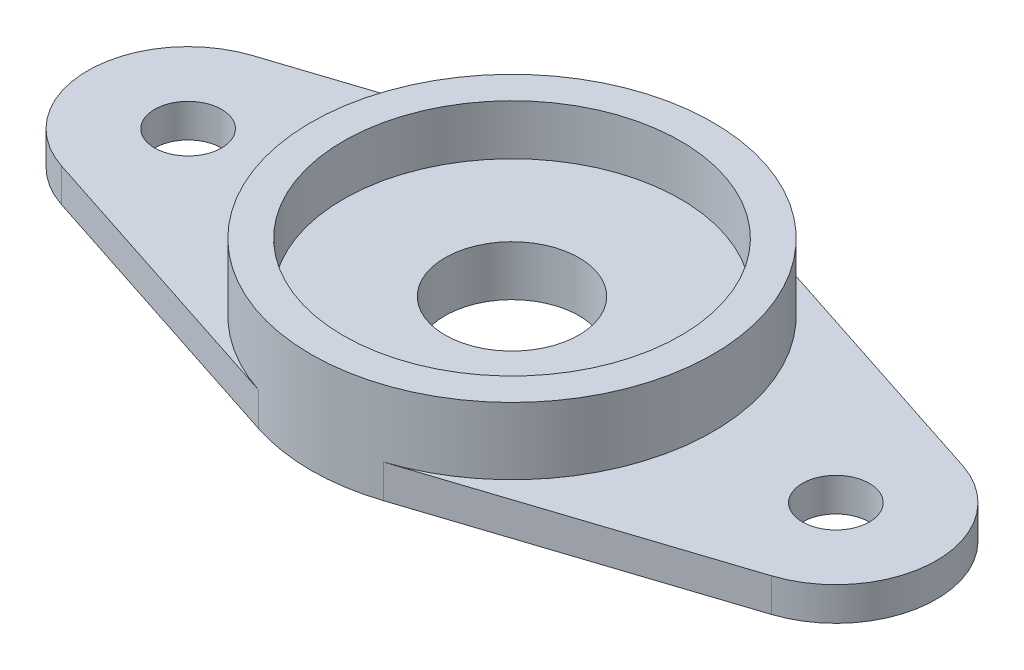
ISO-10303-21;
HEADER;
FILE_DESCRIPTION(('STEP AP214'),'2;1');
FILE_NAME('part.step','',(''),(''),'','','');
FILE_SCHEMA(('AUTOMOTIVE_DESIGN { 1 0 10303 214 1 1 1 1 }'));
ENDSEC;
DATA;
#1=APPLICATION_CONTEXT('core data for automotive mechanical design processes');
#2=APPLICATION_PROTOCOL_DEFINITION('international standard','automotive_design',2000,#1);
#3=PRODUCT_CONTEXT('',#1,'mechanical');
#4=PRODUCT('Part','Part','',(#3));
#5=PRODUCT_RELATED_PRODUCT_CATEGORY('part','',(#4));
#6=PRODUCT_DEFINITION_FORMATION('','',#4);
#7=PRODUCT_DEFINITION_CONTEXT('part definition',#1,'design');
#8=PRODUCT_DEFINITION('design','',#6,#7);
#9=PRODUCT_DEFINITION_SHAPE('','',#8);
#10=(LENGTH_UNIT() NAMED_UNIT(*) SI_UNIT(.MILLI.,.METRE.));
#11=(NAMED_UNIT(*) PLANE_ANGLE_UNIT() SI_UNIT($,.RADIAN.));
#12=(NAMED_UNIT(*) SI_UNIT($,.STERADIAN.) SOLID_ANGLE_UNIT());
#13=UNCERTAINTY_MEASURE_WITH_UNIT(LENGTH_MEASURE(1.E-05),#10,'distance_accuracy_value','');
#14=(GEOMETRIC_REPRESENTATION_CONTEXT(3) GLOBAL_UNCERTAINTY_ASSIGNED_CONTEXT((#13)) GLOBAL_UNIT_ASSIGNED_CONTEXT((#10,
#11,#12)) REPRESENTATION_CONTEXT('',''));
#15=CARTESIAN_POINT('',(0.,0.,0.));
#16=DIRECTION('',(0.,0.,1.));
#17=DIRECTION('',(1.,0.,0.));
#18=AXIS2_PLACEMENT_3D('',#15,#16,#17);
#19=CARTESIAN_POINT('',(-2.79214064115822,4.4972,-8.55593072903191));
#20=DIRECTION('',(-0.31023784901758,0.,-0.950658969892435));
#21=DIRECTION('',(-0.950658969892435,0.,0.31023784901758));
#22=AXIS2_PLACEMENT_3D('',#19,#20,#21);
#23=PLANE('',#22);
#24=DIRECTION('',(0.,-1.,0.));
#25=VECTOR('',#24,1.);
#26=CARTESIAN_POINT('',(-15.9010703205791,4.4972,-4.27796536451595));
#27=LINE('',#26,#25);
#28=CARTESIAN_POINT('',(-15.9010703205791,1.5,-4.27796536451595));
#29=VERTEX_POINT('',#28);
#30=CARTESIAN_POINT('',(-15.9010703205791,0.,-4.27796536451595));
#31=VERTEX_POINT('',#30);
#32=EDGE_CURVE('E12',#29,#31,#27,.T.);
#33=ORIENTED_EDGE('',*,*,#32,.F.);
#34=DIRECTION('',(-0.950658969892435,0.,0.31023784901758));
#35=VECTOR('',#34,1.);
#36=CARTESIAN_POINT('',(-2.79214064115822,1.5,-8.55593072903191));
#37=LINE('',#36,#35);
#38=CARTESIAN_POINT('',(-2.79214064115822,1.5,-8.55593072903191));
#39=VERTEX_POINT('',#38);
#40=EDGE_CURVE('E143',#39,#29,#37,.T.);
#41=ORIENTED_EDGE('',*,*,#40,.F.);
#42=DIRECTION('',(0.,-1.,0.));
#43=VECTOR('',#42,1.);
#44=CARTESIAN_POINT('',(-2.79214064115822,4.4972,-8.55593072903191));
#45=LINE('',#44,#43);
#46=CARTESIAN_POINT('',(-2.79214064115822,0.,-8.55593072903191));
#47=VERTEX_POINT('',#46);
#48=EDGE_CURVE('E87',#39,#47,#45,.T.);
#49=ORIENTED_EDGE('',*,*,#48,.T.);
#50=DIRECTION('',(0.950658969892435,0.,-0.31023784901758));
#51=VECTOR('',#50,1.);
#52=CARTESIAN_POINT('',(-2.79214064115822,0.,-8.55593072903191));
#53=LINE('',#52,#51);
#54=EDGE_CURVE('E193',#31,#47,#53,.T.);
#55=ORIENTED_EDGE('',*,*,#54,.F.);
#56=EDGE_LOOP('',(#33,#41,#49,#55));
#57=FACE_BOUND('',#56,.T.);
#58=ADVANCED_FACE('F72',(#57),#23,.T.);
#59=CARTESIAN_POINT('',(-14.505,4.4972,0.));
#60=DIRECTION('',(0.,-1.,0.));
#61=DIRECTION('',(0.,0.,-1.));
#62=AXIS2_PLACEMENT_3D('',#59,#60,#61);
#63=CYLINDRICAL_SURFACE('',#62,4.5);
#64=CARTESIAN_POINT('',(-14.505,1.5,0.));
#65=DIRECTION('',(0.,1.,0.));
#66=DIRECTION('',(0.,0.,1.));
#67=AXIS2_PLACEMENT_3D('',#64,#65,#66);
#68=CIRCLE('',#67,4.5);
#69=CARTESIAN_POINT('',(-15.9010703205791,1.5,4.27796536451595));
#70=VERTEX_POINT('',#69);
#71=EDGE_CURVE('E138',#29,#70,#68,.T.);
#72=ORIENTED_EDGE('',*,*,#71,.F.);
#73=ORIENTED_EDGE('',*,*,#32,.T.);
#74=CARTESIAN_POINT('',(-14.505,0.,0.));
#75=DIRECTION('',(0.,1.,0.));
#76=DIRECTION('',(0.,0.,1.));
#77=AXIS2_PLACEMENT_3D('',#74,#75,#76);
#78=CIRCLE('',#77,4.5);
#79=CARTESIAN_POINT('',(-15.9010703205791,0.,4.27796536451596));
#80=VERTEX_POINT('',#79);
#81=EDGE_CURVE('E159',#31,#80,#78,.T.);
#82=ORIENTED_EDGE('',*,*,#81,.T.);
#83=DIRECTION('',(0.,-1.,0.));
#84=VECTOR('',#83,1.);
#85=CARTESIAN_POINT('',(-15.9010703205791,4.4972,4.27796536451596));
#86=LINE('',#85,#84);
#87=EDGE_CURVE('E80',#70,#80,#86,.T.);
#88=ORIENTED_EDGE('',*,*,#87,.F.);
#89=EDGE_LOOP('',(#72,#73,#82,#88));
#90=FACE_BOUND('',#89,.T.);
#91=ADVANCED_FACE('F157',(#90),#63,.T.);
#92=CARTESIAN_POINT('',(-2.79214064115822,4.4972,8.55593072903191));
#93=DIRECTION('',(0.31023784901758,0.,-0.950658969892435));
#94=DIRECTION('',(-0.950658969892435,0.,-0.31023784901758));
#95=AXIS2_PLACEMENT_3D('',#92,#93,#94);
#96=PLANE('',#95);
#97=DIRECTION('',(-0.950658969892435,0.,-0.31023784901758));
#98=VECTOR('',#97,1.);
#99=CARTESIAN_POINT('',(-2.79214064115822,1.5,8.55593072903191));
#100=LINE('',#99,#98);
#101=CARTESIAN_POINT('',(-2.79214064115823,1.5,8.55593072903191));
#102=VERTEX_POINT('',#101);
#103=EDGE_CURVE('E141',#102,#70,#100,.T.);
#104=ORIENTED_EDGE('',*,*,#103,.T.);
#105=ORIENTED_EDGE('',*,*,#87,.T.);
#106=DIRECTION('',(0.950658969892435,0.,0.31023784901758));
#107=VECTOR('',#106,1.);
#108=CARTESIAN_POINT('',(-2.79214064115822,0.,8.55593072903191));
#109=LINE('',#108,#107);
#110=CARTESIAN_POINT('',(-2.79214064115823,0.,8.55593072903191));
#111=VERTEX_POINT('',#110);
#112=EDGE_CURVE('E190',#80,#111,#109,.T.);
#113=ORIENTED_EDGE('',*,*,#112,.T.);
#114=DIRECTION('',(0.,-1.,0.));
#115=VECTOR('',#114,1.);
#116=CARTESIAN_POINT('',(-2.79214064115823,4.4972,8.55593072903191));
#117=LINE('',#116,#115);
#118=EDGE_CURVE('E153',#102,#111,#117,.T.);
#119=ORIENTED_EDGE('',*,*,#118,.F.);
#120=EDGE_LOOP('',(#104,#105,#113,#119));
#121=FACE_BOUND('',#120,.T.);
#122=ADVANCED_FACE('F150',(#121),#96,.F.);
#123=CARTESIAN_POINT('',(2.79214064115822,4.4972,8.55593072903191));
#124=DIRECTION('',(-0.31023784901758,0.,-0.950658969892435));
#125=DIRECTION('',(-0.950658969892435,0.,0.310237849017581));
#126=AXIS2_PLACEMENT_3D('',#123,#124,#125);
#127=PLANE('',#126);
#128=DIRECTION('',(-0.950658969892435,0.,0.31023784901758));
#129=VECTOR('',#128,1.);
#130=CARTESIAN_POINT('',(2.79214064115823,1.5,8.55593072903191));
#131=LINE('',#130,#129);
#132=CARTESIAN_POINT('',(15.9010703205791,1.5,4.27796536451595));
#133=VERTEX_POINT('',#132);
#134=CARTESIAN_POINT('',(2.79214064115823,1.5,8.55593072903191));
#135=VERTEX_POINT('',#134);
#136=EDGE_CURVE('E210',#133,#135,#131,.T.);
#137=ORIENTED_EDGE('',*,*,#136,.T.);
#138=DIRECTION('',(0.,-1.,0.));
#139=VECTOR('',#138,1.);
#140=CARTESIAN_POINT('',(2.79214064115822,4.4972,8.55593072903191));
#141=LINE('',#140,#139);
#142=CARTESIAN_POINT('',(2.79214064115822,0.,8.55593072903191));
#143=VERTEX_POINT('',#142);
#144=EDGE_CURVE('E160',#135,#143,#141,.T.);
#145=ORIENTED_EDGE('',*,*,#144,.T.);
#146=DIRECTION('',(0.950658969892435,0.,-0.310237849017581));
#147=VECTOR('',#146,1.);
#148=CARTESIAN_POINT('',(2.79214064115822,0.,8.55593072903191));
#149=LINE('',#148,#147);
#150=CARTESIAN_POINT('',(15.9010703205791,0.,4.27796536451595));
#151=VERTEX_POINT('',#150);
#152=EDGE_CURVE('E184',#143,#151,#149,.T.);
#153=ORIENTED_EDGE('',*,*,#152,.T.);
#154=DIRECTION('',(0.,-1.,0.));
#155=VECTOR('',#154,1.);
#156=CARTESIAN_POINT('',(15.9010703205791,4.4972,4.27796536451595));
#157=LINE('',#156,#155);
#158=EDGE_CURVE('E164',#133,#151,#157,.T.);
#159=ORIENTED_EDGE('',*,*,#158,.F.);
#160=EDGE_LOOP('',(#137,#145,#153,#159));
#161=FACE_BOUND('',#160,.T.);
#162=ADVANCED_FACE('F246',(#161),#127,.F.);
#163=CARTESIAN_POINT('',(14.505,4.4972,0.));
#164=DIRECTION('',(0.,-1.,0.));
#165=DIRECTION('',(0.,0.,-1.));
#166=AXIS2_PLACEMENT_3D('',#163,#164,#165);
#167=CYLINDRICAL_SURFACE('',#166,4.5);
#168=CARTESIAN_POINT('',(14.505,1.5,0.));
#169=DIRECTION('',(0.,1.,0.));
#170=DIRECTION('',(0.,0.,1.));
#171=AXIS2_PLACEMENT_3D('',#168,#169,#170);
#172=CIRCLE('',#171,4.5);
#173=CARTESIAN_POINT('',(15.9010703205791,1.5,-4.27796536451596));
#174=VERTEX_POINT('',#173);
#175=EDGE_CURVE('E218',#133,#174,#172,.T.);
#176=ORIENTED_EDGE('',*,*,#175,.F.);
#177=ORIENTED_EDGE('',*,*,#158,.T.);
#178=CARTESIAN_POINT('',(14.505,0.,0.));
#179=DIRECTION('',(0.,1.,0.));
#180=DIRECTION('',(0.,0.,1.));
#181=AXIS2_PLACEMENT_3D('',#178,#179,#180);
#182=CIRCLE('',#181,4.5);
#183=CARTESIAN_POINT('',(15.9010703205791,0.,-4.27796536451596));
#184=VERTEX_POINT('',#183);
#185=EDGE_CURVE('E181',#151,#184,#182,.T.);
#186=ORIENTED_EDGE('',*,*,#185,.T.);
#187=DIRECTION('',(0.,-1.,0.));
#188=VECTOR('',#187,1.);
#189=CARTESIAN_POINT('',(15.9010703205791,4.4972,-4.27796536451596));
#190=LINE('',#189,#188);
#191=EDGE_CURVE('E166',#174,#184,#190,.T.);
#192=ORIENTED_EDGE('',*,*,#191,.F.);
#193=EDGE_LOOP('',(#176,#177,#186,#192));
#194=FACE_BOUND('',#193,.T.);
#195=ADVANCED_FACE('F249',(#194),#167,.T.);
#196=CARTESIAN_POINT('',(2.79214064115822,4.4972,-8.55593072903191));
#197=DIRECTION('',(-0.31023784901758,0.,0.950658969892435));
#198=DIRECTION('',(0.950658969892435,0.,0.31023784901758));
#199=AXIS2_PLACEMENT_3D('',#196,#197,#198);
#200=PLANE('',#199);
#201=DIRECTION('',(0.950658969892435,0.,0.31023784901758));
#202=VECTOR('',#201,1.);
#203=CARTESIAN_POINT('',(2.79214064115822,1.5,-8.55593072903191));
#204=LINE('',#203,#202);
#205=CARTESIAN_POINT('',(2.79214064115822,1.5,-8.55593072903191));
#206=VERTEX_POINT('',#205);
#207=EDGE_CURVE('E215',#206,#174,#204,.T.);
#208=ORIENTED_EDGE('',*,*,#207,.T.);
#209=ORIENTED_EDGE('',*,*,#191,.T.);
#210=DIRECTION('',(-0.950658969892435,0.,-0.31023784901758));
#211=VECTOR('',#210,1.);
#212=CARTESIAN_POINT('',(2.79214064115822,0.,-8.55593072903191));
#213=LINE('',#212,#211);
#214=CARTESIAN_POINT('',(2.79214064115822,0.,-8.55593072903191));
#215=VERTEX_POINT('',#214);
#216=EDGE_CURVE('E178',#184,#215,#213,.T.);
#217=ORIENTED_EDGE('',*,*,#216,.T.);
#218=DIRECTION('',(0.,-1.,0.));
#219=VECTOR('',#218,1.);
#220=CARTESIAN_POINT('',(2.79214064115822,4.4972,-8.55593072903191));
#221=LINE('',#220,#219);
#222=EDGE_CURVE('E94',#206,#215,#221,.T.);
#223=ORIENTED_EDGE('',*,*,#222,.F.);
#224=EDGE_LOOP('',(#208,#209,#217,#223));
#225=FACE_BOUND('',#224,.T.);
#226=ADVANCED_FACE('F253',(#225),#200,.F.);
#227=CARTESIAN_POINT('',(14.505,4.4972,0.));
#228=DIRECTION('',(0.,-1.,0.));
#229=DIRECTION('',(0.,0.,-1.));
#230=AXIS2_PLACEMENT_3D('',#227,#228,#229);
#231=CYLINDRICAL_SURFACE('',#230,1.5);
#232=CARTESIAN_POINT('',(14.505,0.,0.));
#233=DIRECTION('',(0.,1.,0.));
#234=DIRECTION('',(0.,0.,1.));
#235=AXIS2_PLACEMENT_3D('',#232,#233,#234);
#236=CIRCLE('',#235,1.5);
#237=CARTESIAN_POINT('',(14.505,0.,1.49999999999999));
#238=VERTEX_POINT('',#237);
#239=EDGE_CURVE('E174',#238,#238,#236,.T.);
#240=ORIENTED_EDGE('',*,*,#239,.F.);
#241=EDGE_LOOP('',(#240));
#242=FACE_BOUND('',#241,.T.);
#243=CARTESIAN_POINT('',(14.505,1.5,0.));
#244=DIRECTION('',(0.,1.,0.));
#245=DIRECTION('',(0.,0.,1.));
#246=AXIS2_PLACEMENT_3D('',#243,#244,#245);
#247=CIRCLE('',#246,1.5);
#248=CARTESIAN_POINT('',(14.505,1.5,1.49999999999999));
#249=VERTEX_POINT('',#248);
#250=EDGE_CURVE('E220',#249,#249,#247,.T.);
#251=ORIENTED_EDGE('',*,*,#250,.T.);
#252=EDGE_LOOP('',(#251));
#253=FACE_BOUND('',#252,.T.);
#254=ADVANCED_FACE('F257',(#242,#253),#231,.F.);
#255=CARTESIAN_POINT('',(-14.505,4.4972,0.));
#256=DIRECTION('',(0.,-1.,0.));
#257=DIRECTION('',(0.,0.,-1.));
#258=AXIS2_PLACEMENT_3D('',#255,#256,#257);
#259=CYLINDRICAL_SURFACE('',#258,1.5);
#260=CARTESIAN_POINT('',(-14.505,0.,0.));
#261=DIRECTION('',(0.,1.,0.));
#262=DIRECTION('',(0.,0.,1.));
#263=AXIS2_PLACEMENT_3D('',#260,#261,#262);
#264=CIRCLE('',#263,1.5);
#265=CARTESIAN_POINT('',(-14.505,0.,1.5));
#266=VERTEX_POINT('',#265);
#267=EDGE_CURVE('E196',#266,#266,#264,.T.);
#268=ORIENTED_EDGE('',*,*,#267,.F.);
#269=EDGE_LOOP('',(#268));
#270=FACE_BOUND('',#269,.T.);
#271=CARTESIAN_POINT('',(-14.505,1.5,0.));
#272=DIRECTION('',(0.,1.,0.));
#273=DIRECTION('',(0.,0.,1.));
#274=AXIS2_PLACEMENT_3D('',#271,#272,#273);
#275=CIRCLE('',#274,1.5);
#276=CARTESIAN_POINT('',(-14.505,1.5,1.5));
#277=VERTEX_POINT('',#276);
#278=EDGE_CURVE('E147',#277,#277,#275,.T.);
#279=ORIENTED_EDGE('',*,*,#278,.T.);
#280=EDGE_LOOP('',(#279));
#281=FACE_BOUND('',#280,.T.);
#282=ADVANCED_FACE('F74',(#270,#281),#259,.F.);
#283=CARTESIAN_POINT('',(0.,4.4972,0.));
#284=DIRECTION('',(0.,1.,0.));
#285=DIRECTION('',(0.,0.,1.));
#286=AXIS2_PLACEMENT_3D('',#283,#284,#285);
#287=PLANE('',#286);
#288=CARTESIAN_POINT('',(0.,4.4972,0.));
#289=DIRECTION('',(0.,1.,0.));
#290=DIRECTION('',(0.,0.,1.));
#291=AXIS2_PLACEMENT_3D('',#288,#289,#290);
#292=CIRCLE('',#291,7.55);
#293=CARTESIAN_POINT('',(0.,4.4972,7.55));
#294=VERTEX_POINT('',#293);
#295=EDGE_CURVE('E202',#294,#294,#292,.T.);
#296=ORIENTED_EDGE('',*,*,#295,.F.);
#297=EDGE_LOOP('',(#296));
#298=FACE_BOUND('',#297,.T.);
#299=CARTESIAN_POINT('',(0.,4.4972,0.));
#300=DIRECTION('',(0.,1.,0.));
#301=DIRECTION('',(0.,0.,1.));
#302=AXIS2_PLACEMENT_3D('',#299,#300,#301);
#303=CIRCLE('',#302,9.);
#304=CARTESIAN_POINT('',(0.,4.4972,9.));
#305=VERTEX_POINT('',#304);
#306=EDGE_CURVE('E170',#305,#305,#303,.T.);
#307=ORIENTED_EDGE('',*,*,#306,.T.);
#308=EDGE_LOOP('',(#307));
#309=FACE_BOUND('',#308,.T.);
#310=ADVANCED_FACE('F269',(#298,#309),#287,.T.);
#311=CARTESIAN_POINT('',(0.,4.4972,0.));
#312=DIRECTION('',(0.,-1.,0.));
#313=DIRECTION('',(0.,0.,-1.));
#314=AXIS2_PLACEMENT_3D('',#311,#312,#313);
#315=CYLINDRICAL_SURFACE('',#314,3.);
#316=CARTESIAN_POINT('',(0.,0.,0.));
#317=DIRECTION('',(0.,1.,0.));
#318=DIRECTION('',(0.,0.,1.));
#319=AXIS2_PLACEMENT_3D('',#316,#317,#318);
#320=CIRCLE('',#319,3.);
#321=CARTESIAN_POINT('',(0.,0.,3.));
#322=VERTEX_POINT('',#321);
#323=EDGE_CURVE('E171',#322,#322,#320,.T.);
#324=ORIENTED_EDGE('',*,*,#323,.F.);
#325=EDGE_LOOP('',(#324));
#326=FACE_BOUND('',#325,.T.);
#327=CARTESIAN_POINT('',(0.,2.2472,0.));
#328=DIRECTION('',(0.,1.,0.));
#329=DIRECTION('',(0.,0.,1.));
#330=AXIS2_PLACEMENT_3D('',#327,#328,#329);
#331=CIRCLE('',#330,3.);
#332=CARTESIAN_POINT('',(0.,2.2472,3.));
#333=VERTEX_POINT('',#332);
#334=EDGE_CURVE('E205',#333,#333,#331,.T.);
#335=ORIENTED_EDGE('',*,*,#334,.T.);
#336=EDGE_LOOP('',(#335));
#337=FACE_BOUND('',#336,.T.);
#338=ADVANCED_FACE('F263',(#326,#337),#315,.F.);
#339=CARTESIAN_POINT('',(0.,4.4972,0.));
#340=DIRECTION('',(0.,-1.,0.));
#341=DIRECTION('',(0.,0.,-1.));
#342=AXIS2_PLACEMENT_3D('',#339,#340,#341);
#343=CYLINDRICAL_SURFACE('',#342,9.);
#344=CARTESIAN_POINT('',(0.,1.5,0.));
#345=DIRECTION('',(0.,1.,0.));
#346=DIRECTION('',(0.,0.,1.));
#347=AXIS2_PLACEMENT_3D('',#344,#345,#346);
#348=CIRCLE('',#347,9.);
#349=EDGE_CURVE('E154',#39,#102,#348,.T.);
#350=ORIENTED_EDGE('',*,*,#349,.T.);
#351=ORIENTED_EDGE('',*,*,#118,.T.);
#352=CARTESIAN_POINT('',(0.,0.,0.));
#353=DIRECTION('',(0.,1.,0.));
#354=DIRECTION('',(0.,0.,1.));
#355=AXIS2_PLACEMENT_3D('',#352,#353,#354);
#356=CIRCLE('',#355,9.);
#357=EDGE_CURVE('E187',#111,#143,#356,.T.);
#358=ORIENTED_EDGE('',*,*,#357,.T.);
#359=ORIENTED_EDGE('',*,*,#144,.F.);
#360=CARTESIAN_POINT('',(0.,1.5,0.));
#361=DIRECTION('',(0.,1.,0.));
#362=DIRECTION('',(0.,0.,1.));
#363=AXIS2_PLACEMENT_3D('',#360,#361,#362);
#364=CIRCLE('',#363,9.);
#365=EDGE_CURVE('E213',#135,#206,#364,.T.);
#366=ORIENTED_EDGE('',*,*,#365,.T.);
#367=ORIENTED_EDGE('',*,*,#222,.T.);
#368=EDGE_CURVE('E177',#215,#47,#356,.T.);
#369=ORIENTED_EDGE('',*,*,#368,.T.);
#370=ORIENTED_EDGE('',*,*,#48,.F.);
#371=EDGE_LOOP('',(#350,#351,#358,#359,#366,#367,#369,#370));
#372=FACE_BOUND('',#371,.T.);
#373=ORIENTED_EDGE('',*,*,#306,.F.);
#374=EDGE_LOOP('',(#373));
#375=FACE_BOUND('',#374,.T.);
#376=ADVANCED_FACE('F259',(#372,#375),#343,.T.);
#377=CARTESIAN_POINT('',(0.,0.,0.));
#378=DIRECTION('',(0.,1.,0.));
#379=DIRECTION('',(0.,0.,1.));
#380=AXIS2_PLACEMENT_3D('',#377,#378,#379);
#381=PLANE('',#380);
#382=ORIENTED_EDGE('',*,*,#267,.T.);
#383=EDGE_LOOP('',(#382));
#384=FACE_BOUND('',#383,.T.);
#385=ORIENTED_EDGE('',*,*,#54,.T.);
#386=ORIENTED_EDGE('',*,*,#368,.F.);
#387=ORIENTED_EDGE('',*,*,#216,.F.);
#388=ORIENTED_EDGE('',*,*,#185,.F.);
#389=ORIENTED_EDGE('',*,*,#152,.F.);
#390=ORIENTED_EDGE('',*,*,#357,.F.);
#391=ORIENTED_EDGE('',*,*,#112,.F.);
#392=ORIENTED_EDGE('',*,*,#81,.F.);
#393=EDGE_LOOP('',(#385,#386,#387,#388,#389,#390,#391,#392));
#394=FACE_BOUND('',#393,.T.);
#395=ORIENTED_EDGE('',*,*,#239,.T.);
#396=EDGE_LOOP('',(#395));
#397=FACE_BOUND('',#396,.T.);
#398=ORIENTED_EDGE('',*,*,#323,.T.);
#399=EDGE_LOOP('',(#398));
#400=FACE_BOUND('',#399,.T.);
#401=ADVANCED_FACE('F262',(#384,#394,#397,#400),#381,.F.);
#402=CARTESIAN_POINT('',(0.,2.2472,0.));
#403=DIRECTION('',(0.,1.,0.));
#404=DIRECTION('',(0.,0.,1.));
#405=AXIS2_PLACEMENT_3D('',#402,#403,#404);
#406=CYLINDRICAL_SURFACE('',#405,7.55);
#407=CARTESIAN_POINT('',(0.,2.2472,0.));
#408=DIRECTION('',(0.,1.,0.));
#409=DIRECTION('',(0.,0.,1.));
#410=AXIS2_PLACEMENT_3D('',#407,#408,#409);
#411=CIRCLE('',#410,7.55);
#412=CARTESIAN_POINT('',(0.,2.2472,7.55));
#413=VERTEX_POINT('',#412);
#414=EDGE_CURVE('E199',#413,#413,#411,.T.);
#415=ORIENTED_EDGE('',*,*,#414,.F.);
#416=EDGE_LOOP('',(#415));
#417=FACE_BOUND('',#416,.T.);
#418=ORIENTED_EDGE('',*,*,#295,.T.);
#419=EDGE_LOOP('',(#418));
#420=FACE_BOUND('',#419,.T.);
#421=ADVANCED_FACE('F273',(#417,#420),#406,.F.);
#422=CARTESIAN_POINT('',(0.,2.2472,0.));
#423=DIRECTION('',(0.,1.,0.));
#424=DIRECTION('',(0.,0.,1.));
#425=AXIS2_PLACEMENT_3D('',#422,#423,#424);
#426=PLANE('',#425);
#427=ORIENTED_EDGE('',*,*,#334,.F.);
#428=EDGE_LOOP('',(#427));
#429=FACE_BOUND('',#428,.T.);
#430=ORIENTED_EDGE('',*,*,#414,.T.);
#431=EDGE_LOOP('',(#430));
#432=FACE_BOUND('',#431,.T.);
#433=ADVANCED_FACE('F235',(#429,#432),#426,.T.);
#434=CARTESIAN_POINT('',(14.505,1.5,0.));
#435=DIRECTION('',(0.,1.,0.));
#436=DIRECTION('',(0.,0.,1.));
#437=AXIS2_PLACEMENT_3D('',#434,#435,#436);
#438=PLANE('',#437);
#439=ORIENTED_EDGE('',*,*,#250,.F.);
#440=EDGE_LOOP('',(#439));
#441=FACE_BOUND('',#440,.T.);
#442=ORIENTED_EDGE('',*,*,#175,.T.);
#443=ORIENTED_EDGE('',*,*,#207,.F.);
#444=ORIENTED_EDGE('',*,*,#365,.F.);
#445=ORIENTED_EDGE('',*,*,#136,.F.);
#446=EDGE_LOOP('',(#442,#443,#444,#445));
#447=FACE_BOUND('',#446,.T.);
#448=ADVANCED_FACE('F230',(#441,#447),#438,.T.);
#449=CARTESIAN_POINT('',(-14.505,1.5,0.));
#450=DIRECTION('',(0.,1.,0.));
#451=DIRECTION('',(0.,0.,1.));
#452=AXIS2_PLACEMENT_3D('',#449,#450,#451);
#453=PLANE('',#452);
#454=ORIENTED_EDGE('',*,*,#278,.F.);
#455=EDGE_LOOP('',(#454));
#456=FACE_BOUND('',#455,.T.);
#457=ORIENTED_EDGE('',*,*,#71,.T.);
#458=ORIENTED_EDGE('',*,*,#103,.F.);
#459=ORIENTED_EDGE('',*,*,#349,.F.);
#460=ORIENTED_EDGE('',*,*,#40,.T.);
#461=EDGE_LOOP('',(#457,#458,#459,#460));
#462=FACE_BOUND('',#461,.T.);
#463=ADVANCED_FACE('F140',(#456,#462),#453,.T.);
#464=CLOSED_SHELL('',(#58,#91,#122,#162,#195,#226,#254,#282,#310,#338,#376,#401,#421,#433,#448,#463));
#465=MANIFOLD_SOLID_BREP('B2',#464);
#466=ADVANCED_BREP_SHAPE_REPRESENTATION('',(#18,#465),#14);
#467=SHAPE_DEFINITION_REPRESENTATION(#9,#466);
ENDSEC;
END-ISO-10303-21;
